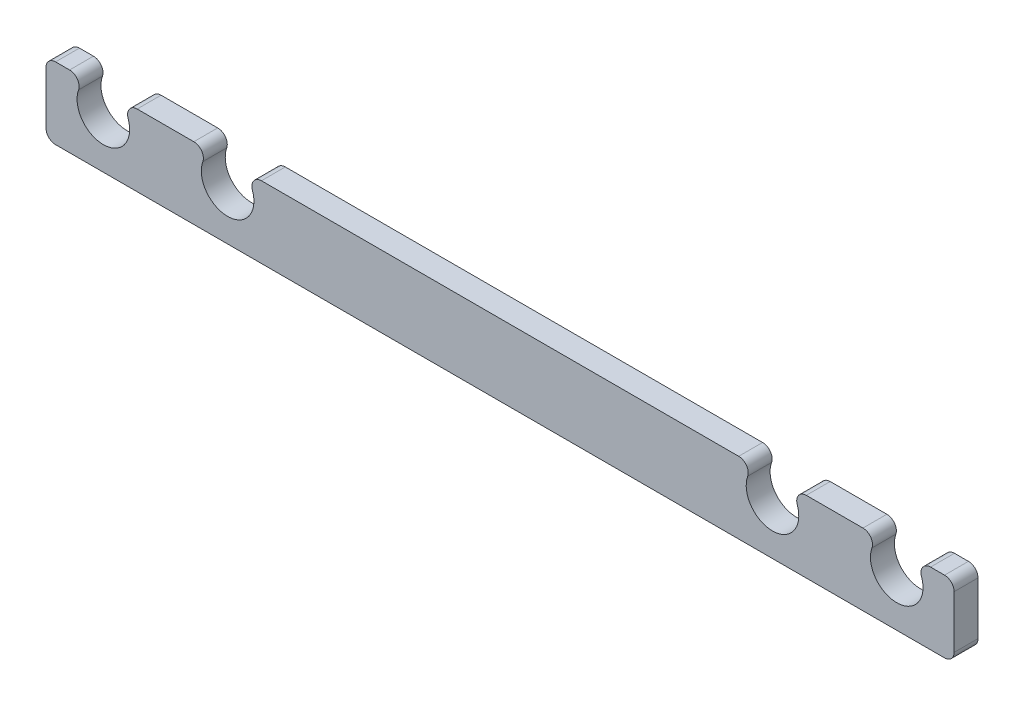
ISO-10303-21;
HEADER;
FILE_DESCRIPTION(('STEP AP214'),'2;1');
FILE_NAME('part.step','',(''),(''),'','','');
FILE_SCHEMA(('AUTOMOTIVE_DESIGN { 1 0 10303 214 1 1 1 1 }'));
ENDSEC;
DATA;
#1=APPLICATION_CONTEXT('core data for automotive mechanical design processes');
#2=APPLICATION_PROTOCOL_DEFINITION('international standard','automotive_design',2000,#1);
#3=PRODUCT_CONTEXT('',#1,'mechanical');
#4=PRODUCT('Part','Part','',(#3));
#5=PRODUCT_RELATED_PRODUCT_CATEGORY('part','',(#4));
#6=PRODUCT_DEFINITION_FORMATION('','',#4);
#7=PRODUCT_DEFINITION_CONTEXT('part definition',#1,'design');
#8=PRODUCT_DEFINITION('design','',#6,#7);
#9=PRODUCT_DEFINITION_SHAPE('','',#8);
#10=(LENGTH_UNIT() NAMED_UNIT(*) SI_UNIT(.MILLI.,.METRE.));
#11=(NAMED_UNIT(*) PLANE_ANGLE_UNIT() SI_UNIT($,.RADIAN.));
#12=(NAMED_UNIT(*) SI_UNIT($,.STERADIAN.) SOLID_ANGLE_UNIT());
#13=UNCERTAINTY_MEASURE_WITH_UNIT(LENGTH_MEASURE(1.E-05),#10,'distance_accuracy_value','');
#14=(GEOMETRIC_REPRESENTATION_CONTEXT(3) GLOBAL_UNCERTAINTY_ASSIGNED_CONTEXT((#13)) GLOBAL_UNIT_ASSIGNED_CONTEXT((#10,
#11,#12)) REPRESENTATION_CONTEXT('',''));
#15=CARTESIAN_POINT('',(0.,0.,0.));
#16=DIRECTION('',(0.,0.,1.));
#17=DIRECTION('',(1.,0.,0.));
#18=AXIS2_PLACEMENT_3D('',#15,#16,#17);
#19=CARTESIAN_POINT('',(-95.,0.,5.));
#20=DIRECTION('',(0.,-1.,0.));
#21=DIRECTION('',(0.,0.,-1.));
#22=AXIS2_PLACEMENT_3D('',#19,#20,#21);
#23=PLANE('',#22);
#24=DIRECTION('',(-1.,0.,0.));
#25=VECTOR('',#24,1.);
#26=CARTESIAN_POINT('',(-95.,0.,5.));
#27=LINE('',#26,#25);
#28=CARTESIAN_POINT('',(-90.0710678118655,0.,5.));
#29=VERTEX_POINT('',#28);
#30=CARTESIAN_POINT('',(-93.,0.,5.));
#31=VERTEX_POINT('',#30);
#32=EDGE_CURVE('E221',#29,#31,#27,.T.);
#33=ORIENTED_EDGE('',*,*,#32,.F.);
#34=DIRECTION('',(0.,0.,-1.));
#35=VECTOR('',#34,1.);
#36=CARTESIAN_POINT('',(-90.0710678118655,0.,5.));
#37=LINE('',#36,#35);
#38=CARTESIAN_POINT('',(-90.0710678118655,0.,0.));
#39=VERTEX_POINT('',#38);
#40=EDGE_CURVE('E206',#29,#39,#37,.T.);
#41=ORIENTED_EDGE('',*,*,#40,.T.);
#42=DIRECTION('',(-1.,0.,0.));
#43=VECTOR('',#42,1.);
#44=CARTESIAN_POINT('',(-95.,0.,0.));
#45=LINE('',#44,#43);
#46=CARTESIAN_POINT('',(-93.,0.,0.));
#47=VERTEX_POINT('',#46);
#48=EDGE_CURVE('E218',#39,#47,#45,.T.);
#49=ORIENTED_EDGE('',*,*,#48,.T.);
#50=DIRECTION('',(0.,0.,-1.));
#51=VECTOR('',#50,1.);
#52=CARTESIAN_POINT('',(-93.,0.,5.));
#53=LINE('',#52,#51);
#54=EDGE_CURVE('E223',#47,#31,#53,.F.);
#55=ORIENTED_EDGE('',*,*,#54,.T.);
#56=EDGE_LOOP('',(#33,#41,#49,#55));
#57=FACE_BOUND('',#56,.T.);
#58=ADVANCED_FACE('F40',(#57),#23,.F.);
#59=CARTESIAN_POINT('',(-95.,-15.,5.));
#60=DIRECTION('',(1.,0.,0.));
#61=DIRECTION('',(0.,0.,-1.));
#62=AXIS2_PLACEMENT_3D('',#59,#60,#61);
#63=PLANE('',#62);
#64=DIRECTION('',(0.,-1.,0.));
#65=VECTOR('',#64,1.);
#66=CARTESIAN_POINT('',(-95.,-15.,0.));
#67=LINE('',#66,#65);
#68=CARTESIAN_POINT('',(-95.,-2.,0.));
#69=VERTEX_POINT('',#68);
#70=CARTESIAN_POINT('',(-95.,-13.,0.));
#71=VERTEX_POINT('',#70);
#72=EDGE_CURVE('E228',#69,#71,#67,.T.);
#73=ORIENTED_EDGE('',*,*,#72,.T.);
#74=DIRECTION('',(0.,0.,-1.));
#75=VECTOR('',#74,1.);
#76=CARTESIAN_POINT('',(-95.,-13.,5.));
#77=LINE('',#76,#75);
#78=CARTESIAN_POINT('',(-95.,-13.,5.));
#79=VERTEX_POINT('',#78);
#80=EDGE_CURVE('E330',#71,#79,#77,.F.);
#81=ORIENTED_EDGE('',*,*,#80,.T.);
#82=DIRECTION('',(0.,-1.,0.));
#83=VECTOR('',#82,1.);
#84=CARTESIAN_POINT('',(-95.,-15.,5.));
#85=LINE('',#84,#83);
#86=CARTESIAN_POINT('',(-95.,-2.,5.));
#87=VERTEX_POINT('',#86);
#88=EDGE_CURVE('E553',#87,#79,#85,.T.);
#89=ORIENTED_EDGE('',*,*,#88,.F.);
#90=DIRECTION('',(0.,0.,-1.));
#91=VECTOR('',#90,1.);
#92=CARTESIAN_POINT('',(-95.,-2.,5.));
#93=LINE('',#92,#91);
#94=EDGE_CURVE('E327',#87,#69,#93,.T.);
#95=ORIENTED_EDGE('',*,*,#94,.T.);
#96=EDGE_LOOP('',(#73,#81,#89,#95));
#97=FACE_BOUND('',#96,.T.);
#98=ADVANCED_FACE('F483',(#97),#63,.F.);
#99=CARTESIAN_POINT('',(95.,-15.,5.));
#100=DIRECTION('',(0.,1.,0.));
#101=DIRECTION('',(0.,0.,1.));
#102=AXIS2_PLACEMENT_3D('',#99,#100,#101);
#103=PLANE('',#102);
#104=DIRECTION('',(1.,0.,0.));
#105=VECTOR('',#104,1.);
#106=CARTESIAN_POINT('',(95.,-15.,5.));
#107=LINE('',#106,#105);
#108=CARTESIAN_POINT('',(-93.,-15.,5.));
#109=VERTEX_POINT('',#108);
#110=CARTESIAN_POINT('',(93.,-15.,5.));
#111=VERTEX_POINT('',#110);
#112=EDGE_CURVE('E551',#109,#111,#107,.T.);
#113=ORIENTED_EDGE('',*,*,#112,.F.);
#114=DIRECTION('',(0.,0.,-1.));
#115=VECTOR('',#114,1.);
#116=CARTESIAN_POINT('',(-93.,-15.,5.));
#117=LINE('',#116,#115);
#118=CARTESIAN_POINT('',(-93.,-15.,0.));
#119=VERTEX_POINT('',#118);
#120=EDGE_CURVE('E324',#109,#119,#117,.T.);
#121=ORIENTED_EDGE('',*,*,#120,.T.);
#122=DIRECTION('',(1.,0.,0.));
#123=VECTOR('',#122,1.);
#124=CARTESIAN_POINT('',(95.,-15.,0.));
#125=LINE('',#124,#123);
#126=CARTESIAN_POINT('',(93.,-15.,0.));
#127=VERTEX_POINT('',#126);
#128=EDGE_CURVE('E231',#119,#127,#125,.T.);
#129=ORIENTED_EDGE('',*,*,#128,.T.);
#130=DIRECTION('',(0.,0.,-1.));
#131=VECTOR('',#130,1.);
#132=CARTESIAN_POINT('',(93.,-15.,5.));
#133=LINE('',#132,#131);
#134=EDGE_CURVE('E322',#127,#111,#133,.F.);
#135=ORIENTED_EDGE('',*,*,#134,.T.);
#136=EDGE_LOOP('',(#113,#121,#129,#135));
#137=FACE_BOUND('',#136,.T.);
#138=ADVANCED_FACE('F488',(#137),#103,.F.);
#139=CARTESIAN_POINT('',(95.,0.,5.));
#140=DIRECTION('',(-1.,0.,0.));
#141=DIRECTION('',(0.,0.,1.));
#142=AXIS2_PLACEMENT_3D('',#139,#140,#141);
#143=PLANE('',#142);
#144=DIRECTION('',(0.,1.,0.));
#145=VECTOR('',#144,1.);
#146=CARTESIAN_POINT('',(95.,0.,5.));
#147=LINE('',#146,#145);
#148=CARTESIAN_POINT('',(95.,-13.,5.));
#149=VERTEX_POINT('',#148);
#150=CARTESIAN_POINT('',(95.,-2.,5.));
#151=VERTEX_POINT('',#150);
#152=EDGE_CURVE('E397',#149,#151,#147,.T.);
#153=ORIENTED_EDGE('',*,*,#152,.F.);
#154=DIRECTION('',(0.,0.,-1.));
#155=VECTOR('',#154,1.);
#156=CARTESIAN_POINT('',(95.,-13.,5.));
#157=LINE('',#156,#155);
#158=CARTESIAN_POINT('',(95.,-13.,0.));
#159=VERTEX_POINT('',#158);
#160=EDGE_CURVE('E348',#149,#159,#157,.T.);
#161=ORIENTED_EDGE('',*,*,#160,.T.);
#162=DIRECTION('',(0.,1.,0.));
#163=VECTOR('',#162,1.);
#164=CARTESIAN_POINT('',(95.,0.,0.));
#165=LINE('',#164,#163);
#166=CARTESIAN_POINT('',(95.,-2.,0.));
#167=VERTEX_POINT('',#166);
#168=EDGE_CURVE('E239',#159,#167,#165,.T.);
#169=ORIENTED_EDGE('',*,*,#168,.T.);
#170=DIRECTION('',(0.,0.,-1.));
#171=VECTOR('',#170,1.);
#172=CARTESIAN_POINT('',(95.,-2.,5.));
#173=LINE('',#172,#171);
#174=EDGE_CURVE('E346',#167,#151,#173,.F.);
#175=ORIENTED_EDGE('',*,*,#174,.T.);
#176=EDGE_LOOP('',(#153,#161,#169,#175));
#177=FACE_BOUND('',#176,.T.);
#178=ADVANCED_FACE('F578',(#177),#143,.F.);
#179=CARTESIAN_POINT('',(86.1622776601684,0.,5.));
#180=DIRECTION('',(0.,-1.,0.));
#181=DIRECTION('',(0.,0.,-1.));
#182=AXIS2_PLACEMENT_3D('',#179,#180,#181);
#183=PLANE('',#182);
#184=DIRECTION('',(-1.,0.,0.));
#185=VECTOR('',#184,1.);
#186=CARTESIAN_POINT('',(86.1622776601684,0.,0.));
#187=LINE('',#186,#185);
#188=CARTESIAN_POINT('',(93.,0.,0.));
#189=VERTEX_POINT('',#188);
#190=CARTESIAN_POINT('',(90.0710678118655,0.,0.));
#191=VERTEX_POINT('',#190);
#192=EDGE_CURVE('E242',#189,#191,#187,.T.);
#193=ORIENTED_EDGE('',*,*,#192,.T.);
#194=DIRECTION('',(0.,0.,-1.));
#195=VECTOR('',#194,1.);
#196=CARTESIAN_POINT('',(90.0710678118655,0.,5.));
#197=LINE('',#196,#195);
#198=CARTESIAN_POINT('',(90.0710678118655,0.,5.));
#199=VERTEX_POINT('',#198);
#200=EDGE_CURVE('E12',#191,#199,#197,.F.);
#201=ORIENTED_EDGE('',*,*,#200,.T.);
#202=DIRECTION('',(-1.,0.,0.));
#203=VECTOR('',#202,1.);
#204=CARTESIAN_POINT('',(86.1622776601684,0.,5.));
#205=LINE('',#204,#203);
#206=CARTESIAN_POINT('',(93.,0.,5.));
#207=VERTEX_POINT('',#206);
#208=EDGE_CURVE('E373',#207,#199,#205,.T.);
#209=ORIENTED_EDGE('',*,*,#208,.F.);
#210=DIRECTION('',(0.,0.,-1.));
#211=VECTOR('',#210,1.);
#212=CARTESIAN_POINT('',(93.,0.,5.));
#213=LINE('',#212,#211);
#214=EDGE_CURVE('E48',#207,#189,#213,.T.);
#215=ORIENTED_EDGE('',*,*,#214,.T.);
#216=EDGE_LOOP('',(#193,#201,#209,#215));
#217=FACE_BOUND('',#216,.T.);
#218=ADVANCED_FACE('F370',(#217),#183,.F.);
#219=CARTESIAN_POINT('',(83.,-4.5,5.));
#220=DIRECTION('',(0.,0.,-1.));
#221=DIRECTION('',(-1.,0.,0.));
#222=AXIS2_PLACEMENT_3D('',#219,#220,#221);
#223=CYLINDRICAL_SURFACE('',#222,5.5);
#224=CARTESIAN_POINT('',(83.,-4.5,0.));
#225=DIRECTION('',(0.,0.,-1.));
#226=DIRECTION('',(1.,0.,0.));
#227=AXIS2_PLACEMENT_3D('',#224,#225,#226);
#228=CIRCLE('',#227,5.5);
#229=CARTESIAN_POINT('',(88.1854497287013,-2.66666666666666,0.));
#230=VERTEX_POINT('',#229);
#231=CARTESIAN_POINT('',(77.8145502712987,-2.66666666666666,0.));
#232=VERTEX_POINT('',#231);
#233=EDGE_CURVE('E245',#230,#232,#228,.T.);
#234=ORIENTED_EDGE('',*,*,#233,.T.);
#235=DIRECTION('',(0.,0.,-1.));
#236=VECTOR('',#235,1.);
#237=CARTESIAN_POINT('',(77.8145502712987,-2.66666666666666,5.));
#238=LINE('',#237,#236);
#239=CARTESIAN_POINT('',(77.8145502712987,-2.66666666666666,5.));
#240=VERTEX_POINT('',#239);
#241=EDGE_CURVE('E364',#232,#240,#238,.F.);
#242=ORIENTED_EDGE('',*,*,#241,.T.);
#243=CARTESIAN_POINT('',(83.,-4.5,5.));
#244=DIRECTION('',(0.,0.,-1.));
#245=DIRECTION('',(1.,0.,0.));
#246=AXIS2_PLACEMENT_3D('',#243,#244,#245);
#247=CIRCLE('',#246,5.5);
#248=CARTESIAN_POINT('',(88.1854497287013,-2.66666666666666,5.));
#249=VERTEX_POINT('',#248);
#250=EDGE_CURVE('E387',#249,#240,#247,.T.);
#251=ORIENTED_EDGE('',*,*,#250,.F.);
#252=DIRECTION('',(0.,0.,-1.));
#253=VECTOR('',#252,1.);
#254=CARTESIAN_POINT('',(88.1854497287013,-2.66666666666666,5.));
#255=LINE('',#254,#253);
#256=EDGE_CURVE('E361',#249,#230,#255,.T.);
#257=ORIENTED_EDGE('',*,*,#256,.T.);
#258=EDGE_LOOP('',(#234,#242,#251,#257));
#259=FACE_BOUND('',#258,.T.);
#260=ADVANCED_FACE('F384',(#259),#223,.F.);
#261=CARTESIAN_POINT('',(60.1622776601684,0.,5.));
#262=DIRECTION('',(0.,-1.,0.));
#263=DIRECTION('',(0.,0.,-1.));
#264=AXIS2_PLACEMENT_3D('',#261,#262,#263);
#265=PLANE('',#264);
#266=DIRECTION('',(-1.,0.,0.));
#267=VECTOR('',#266,1.);
#268=CARTESIAN_POINT('',(60.1622776601684,0.,0.));
#269=LINE('',#268,#267);
#270=CARTESIAN_POINT('',(75.9289321881345,0.,0.));
#271=VERTEX_POINT('',#270);
#272=CARTESIAN_POINT('',(64.0710678118655,0.,0.));
#273=VERTEX_POINT('',#272);
#274=EDGE_CURVE('E248',#271,#273,#269,.T.);
#275=ORIENTED_EDGE('',*,*,#274,.T.);
#276=DIRECTION('',(0.,0.,-1.));
#277=VECTOR('',#276,1.);
#278=CARTESIAN_POINT('',(64.0710678118655,0.,5.));
#279=LINE('',#278,#277);
#280=CARTESIAN_POINT('',(64.0710678118655,0.,5.));
#281=VERTEX_POINT('',#280);
#282=EDGE_CURVE('E359',#273,#281,#279,.F.);
#283=ORIENTED_EDGE('',*,*,#282,.T.);
#284=DIRECTION('',(-1.,0.,0.));
#285=VECTOR('',#284,1.);
#286=CARTESIAN_POINT('',(60.1622776601684,0.,5.));
#287=LINE('',#286,#285);
#288=CARTESIAN_POINT('',(75.9289321881345,0.,5.));
#289=VERTEX_POINT('',#288);
#290=EDGE_CURVE('E390',#289,#281,#287,.T.);
#291=ORIENTED_EDGE('',*,*,#290,.F.);
#292=DIRECTION('',(0.,0.,-1.));
#293=VECTOR('',#292,1.);
#294=CARTESIAN_POINT('',(75.9289321881345,0.,5.));
#295=LINE('',#294,#293);
#296=EDGE_CURVE('E356',#289,#271,#295,.T.);
#297=ORIENTED_EDGE('',*,*,#296,.T.);
#298=EDGE_LOOP('',(#275,#283,#291,#297));
#299=FACE_BOUND('',#298,.T.);
#300=ADVANCED_FACE('F470',(#299),#265,.F.);
#301=CARTESIAN_POINT('',(57.,-4.5,5.));
#302=DIRECTION('',(0.,0.,-1.));
#303=DIRECTION('',(-1.,0.,0.));
#304=AXIS2_PLACEMENT_3D('',#301,#302,#303);
#305=CYLINDRICAL_SURFACE('',#304,5.5);
#306=CARTESIAN_POINT('',(57.,-4.5,0.));
#307=DIRECTION('',(0.,0.,-1.));
#308=DIRECTION('',(-1.,0.,0.));
#309=AXIS2_PLACEMENT_3D('',#306,#307,#308);
#310=CIRCLE('',#309,5.5);
#311=CARTESIAN_POINT('',(62.1854497287014,-2.66666666666667,0.));
#312=VERTEX_POINT('',#311);
#313=CARTESIAN_POINT('',(51.8145502712987,-2.66666666666667,0.));
#314=VERTEX_POINT('',#313);
#315=EDGE_CURVE('E251',#312,#314,#310,.T.);
#316=ORIENTED_EDGE('',*,*,#315,.T.);
#317=DIRECTION('',(0.,0.,-1.));
#318=VECTOR('',#317,1.);
#319=CARTESIAN_POINT('',(51.8145502712987,-2.66666666666667,5.));
#320=LINE('',#319,#318);
#321=CARTESIAN_POINT('',(51.8145502712987,-2.66666666666667,5.));
#322=VERTEX_POINT('',#321);
#323=EDGE_CURVE('E354',#314,#322,#320,.F.);
#324=ORIENTED_EDGE('',*,*,#323,.T.);
#325=CARTESIAN_POINT('',(57.,-4.5,5.));
#326=DIRECTION('',(0.,0.,-1.));
#327=DIRECTION('',(-1.,0.,0.));
#328=AXIS2_PLACEMENT_3D('',#325,#326,#327);
#329=CIRCLE('',#328,5.5);
#330=CARTESIAN_POINT('',(62.1854497287014,-2.66666666666667,5.));
#331=VERTEX_POINT('',#330);
#332=EDGE_CURVE('E394',#331,#322,#329,.T.);
#333=ORIENTED_EDGE('',*,*,#332,.F.);
#334=DIRECTION('',(0.,0.,-1.));
#335=VECTOR('',#334,1.);
#336=CARTESIAN_POINT('',(62.1854497287014,-2.66666666666667,5.));
#337=LINE('',#336,#335);
#338=EDGE_CURVE('E351',#331,#312,#337,.T.);
#339=ORIENTED_EDGE('',*,*,#338,.T.);
#340=EDGE_LOOP('',(#316,#324,#333,#339));
#341=FACE_BOUND('',#340,.T.);
#342=ADVANCED_FACE('F461',(#341),#305,.F.);
#343=CARTESIAN_POINT('',(-53.8377223398316,0.,5.));
#344=DIRECTION('',(0.,-1.,0.));
#345=DIRECTION('',(0.,0.,-1.));
#346=AXIS2_PLACEMENT_3D('',#343,#344,#345);
#347=PLANE('',#346);
#348=DIRECTION('',(-1.,0.,0.));
#349=VECTOR('',#348,1.);
#350=CARTESIAN_POINT('',(-53.8377223398316,0.,0.));
#351=LINE('',#350,#349);
#352=CARTESIAN_POINT('',(49.9289321881345,0.,0.));
#353=VERTEX_POINT('',#352);
#354=CARTESIAN_POINT('',(-49.9289321881345,0.,0.));
#355=VERTEX_POINT('',#354);
#356=EDGE_CURVE('E254',#353,#355,#351,.T.);
#357=ORIENTED_EDGE('',*,*,#356,.T.);
#358=DIRECTION('',(0.,0.,-1.));
#359=VECTOR('',#358,1.);
#360=CARTESIAN_POINT('',(-49.9289321881345,0.,5.));
#361=LINE('',#360,#359);
#362=CARTESIAN_POINT('',(-49.9289321881345,0.,5.));
#363=VERTEX_POINT('',#362);
#364=EDGE_CURVE('E340',#355,#363,#361,.F.);
#365=ORIENTED_EDGE('',*,*,#364,.T.);
#366=DIRECTION('',(-1.,0.,0.));
#367=VECTOR('',#366,1.);
#368=CARTESIAN_POINT('',(-53.8377223398316,0.,5.));
#369=LINE('',#368,#367);
#370=CARTESIAN_POINT('',(49.9289321881345,0.,5.));
#371=VERTEX_POINT('',#370);
#372=EDGE_CURVE('E414',#371,#363,#369,.T.);
#373=ORIENTED_EDGE('',*,*,#372,.F.);
#374=DIRECTION('',(0.,0.,-1.));
#375=VECTOR('',#374,1.);
#376=CARTESIAN_POINT('',(49.9289321881345,0.,5.));
#377=LINE('',#376,#375);
#378=EDGE_CURVE('E337',#371,#353,#377,.T.);
#379=ORIENTED_EDGE('',*,*,#378,.T.);
#380=EDGE_LOOP('',(#357,#365,#373,#379));
#381=FACE_BOUND('',#380,.T.);
#382=ADVANCED_FACE('F452',(#381),#347,.F.);
#383=CARTESIAN_POINT('',(-57.,-4.5,5.));
#384=DIRECTION('',(0.,0.,-1.));
#385=DIRECTION('',(-1.,0.,0.));
#386=AXIS2_PLACEMENT_3D('',#383,#384,#385);
#387=CYLINDRICAL_SURFACE('',#386,5.5);
#388=CARTESIAN_POINT('',(-57.,-4.5,5.));
#389=DIRECTION('',(0.,0.,-1.));
#390=DIRECTION('',(1.,0.,0.));
#391=AXIS2_PLACEMENT_3D('',#388,#389,#390);
#392=CIRCLE('',#391,5.5);
#393=CARTESIAN_POINT('',(-51.8145502712987,-2.66666666666667,5.));
#394=VERTEX_POINT('',#393);
#395=CARTESIAN_POINT('',(-62.1854497287014,-2.66666666666667,5.));
#396=VERTEX_POINT('',#395);
#397=EDGE_CURVE('E419',#394,#396,#392,.T.);
#398=ORIENTED_EDGE('',*,*,#397,.F.);
#399=DIRECTION('',(0.,0.,-1.));
#400=VECTOR('',#399,1.);
#401=CARTESIAN_POINT('',(-51.8145502712987,-2.66666666666667,5.));
#402=LINE('',#401,#400);
#403=CARTESIAN_POINT('',(-51.8145502712987,-2.66666666666667,0.));
#404=VERTEX_POINT('',#403);
#405=EDGE_CURVE('E334',#394,#404,#402,.T.);
#406=ORIENTED_EDGE('',*,*,#405,.T.);
#407=CARTESIAN_POINT('',(-57.,-4.5,0.));
#408=DIRECTION('',(0.,0.,-1.));
#409=DIRECTION('',(1.,0.,0.));
#410=AXIS2_PLACEMENT_3D('',#407,#408,#409);
#411=CIRCLE('',#410,5.5);
#412=CARTESIAN_POINT('',(-62.1854497287014,-2.66666666666667,0.));
#413=VERTEX_POINT('',#412);
#414=EDGE_CURVE('E257',#404,#413,#411,.T.);
#415=ORIENTED_EDGE('',*,*,#414,.T.);
#416=DIRECTION('',(0.,0.,-1.));
#417=VECTOR('',#416,1.);
#418=CARTESIAN_POINT('',(-62.1854497287014,-2.66666666666667,5.));
#419=LINE('',#418,#417);
#420=EDGE_CURVE('E332',#413,#396,#419,.F.);
#421=ORIENTED_EDGE('',*,*,#420,.T.);
#422=EDGE_LOOP('',(#398,#406,#415,#421));
#423=FACE_BOUND('',#422,.T.);
#424=ADVANCED_FACE('F444',(#423),#387,.F.);
#425=CARTESIAN_POINT('',(-79.8377223398316,0.,5.));
#426=DIRECTION('',(0.,-1.,0.));
#427=DIRECTION('',(0.,0.,-1.));
#428=AXIS2_PLACEMENT_3D('',#425,#426,#427);
#429=PLANE('',#428);
#430=DIRECTION('',(-1.,0.,0.));
#431=VECTOR('',#430,1.);
#432=CARTESIAN_POINT('',(-79.8377223398316,0.,5.));
#433=LINE('',#432,#431);
#434=CARTESIAN_POINT('',(-64.0710678118655,0.,5.));
#435=VERTEX_POINT('',#434);
#436=CARTESIAN_POINT('',(-75.9289321881345,0.,5.));
#437=VERTEX_POINT('',#436);
#438=EDGE_CURVE('E422',#435,#437,#433,.T.);
#439=ORIENTED_EDGE('',*,*,#438,.F.);
#440=DIRECTION('',(0.,0.,-1.));
#441=VECTOR('',#440,1.);
#442=CARTESIAN_POINT('',(-64.0710678118655,0.,5.));
#443=LINE('',#442,#441);
#444=CARTESIAN_POINT('',(-64.0710678118655,0.,0.));
#445=VERTEX_POINT('',#444);
#446=EDGE_CURVE('E343',#435,#445,#443,.T.);
#447=ORIENTED_EDGE('',*,*,#446,.T.);
#448=DIRECTION('',(-1.,0.,0.));
#449=VECTOR('',#448,1.);
#450=CARTESIAN_POINT('',(-79.8377223398316,0.,0.));
#451=LINE('',#450,#449);
#452=CARTESIAN_POINT('',(-75.9289321881345,0.,0.));
#453=VERTEX_POINT('',#452);
#454=EDGE_CURVE('E260',#445,#453,#451,.T.);
#455=ORIENTED_EDGE('',*,*,#454,.T.);
#456=DIRECTION('',(0.,0.,-1.));
#457=VECTOR('',#456,1.);
#458=CARTESIAN_POINT('',(-75.9289321881345,0.,5.));
#459=LINE('',#458,#457);
#460=EDGE_CURVE('E55',#453,#437,#459,.F.);
#461=ORIENTED_EDGE('',*,*,#460,.T.);
#462=EDGE_LOOP('',(#439,#447,#455,#461));
#463=FACE_BOUND('',#462,.T.);
#464=ADVANCED_FACE('F436',(#463),#429,.F.);
#465=CARTESIAN_POINT('',(-83.,-4.5,5.));
#466=DIRECTION('',(0.,0.,-1.));
#467=DIRECTION('',(-1.,0.,0.));
#468=AXIS2_PLACEMENT_3D('',#465,#466,#467);
#469=CYLINDRICAL_SURFACE('',#468,5.5);
#470=CARTESIAN_POINT('',(-83.,-4.5,0.));
#471=DIRECTION('',(0.,0.,-1.));
#472=DIRECTION('',(-1.,0.,0.));
#473=AXIS2_PLACEMENT_3D('',#470,#471,#472);
#474=CIRCLE('',#473,5.5);
#475=CARTESIAN_POINT('',(-77.8145502712987,-2.66666666666666,0.));
#476=VERTEX_POINT('',#475);
#477=CARTESIAN_POINT('',(-88.1854497287013,-2.66666666666666,0.));
#478=VERTEX_POINT('',#477);
#479=EDGE_CURVE('E262',#476,#478,#474,.T.);
#480=ORIENTED_EDGE('',*,*,#479,.T.);
#481=DIRECTION('',(0.,0.,-1.));
#482=VECTOR('',#481,1.);
#483=CARTESIAN_POINT('',(-88.1854497287013,-2.66666666666666,5.));
#484=LINE('',#483,#482);
#485=CARTESIAN_POINT('',(-88.1854497287013,-2.66666666666666,5.));
#486=VERTEX_POINT('',#485);
#487=EDGE_CURVE('E207',#478,#486,#484,.F.);
#488=ORIENTED_EDGE('',*,*,#487,.T.);
#489=CARTESIAN_POINT('',(-83.,-4.5,5.));
#490=DIRECTION('',(0.,0.,-1.));
#491=DIRECTION('',(-1.,0.,0.));
#492=AXIS2_PLACEMENT_3D('',#489,#490,#491);
#493=CIRCLE('',#492,5.5);
#494=CARTESIAN_POINT('',(-77.8145502712987,-2.66666666666666,5.));
#495=VERTEX_POINT('',#494);
#496=EDGE_CURVE('E234',#495,#486,#493,.T.);
#497=ORIENTED_EDGE('',*,*,#496,.F.);
#498=DIRECTION('',(0.,0.,-1.));
#499=VECTOR('',#498,1.);
#500=CARTESIAN_POINT('',(-77.8145502712987,-2.66666666666666,5.));
#501=LINE('',#500,#499);
#502=EDGE_CURVE('E212',#495,#476,#501,.T.);
#503=ORIENTED_EDGE('',*,*,#502,.T.);
#504=EDGE_LOOP('',(#480,#488,#497,#503));
#505=FACE_BOUND('',#504,.T.);
#506=ADVANCED_FACE('F432',(#505),#469,.F.);
#507=CARTESIAN_POINT('',(-83.,-4.5,5.));
#508=DIRECTION('',(0.,0.,-1.));
#509=DIRECTION('',(-1.,0.,0.));
#510=AXIS2_PLACEMENT_3D('',#507,#508,#509);
#511=PLANE('',#510);
#512=ORIENTED_EDGE('',*,*,#496,.T.);
#513=CARTESIAN_POINT('',(-90.0710678118655,-2.,5.));
#514=DIRECTION('',(0.,0.,-1.));
#515=DIRECTION('',(-1.,0.,0.));
#516=AXIS2_PLACEMENT_3D('',#513,#514,#515);
#517=CIRCLE('',#516,2.);
#518=EDGE_CURVE('E319',#486,#29,#517,.F.);
#519=ORIENTED_EDGE('',*,*,#518,.T.);
#520=ORIENTED_EDGE('',*,*,#32,.T.);
#521=CARTESIAN_POINT('',(-93.,-2.,5.));
#522=DIRECTION('',(0.,0.,-1.));
#523=DIRECTION('',(-1.,0.,0.));
#524=AXIS2_PLACEMENT_3D('',#521,#522,#523);
#525=CIRCLE('',#524,2.);
#526=EDGE_CURVE('E305',#31,#87,#525,.F.);
#527=ORIENTED_EDGE('',*,*,#526,.T.);
#528=ORIENTED_EDGE('',*,*,#88,.T.);
#529=CARTESIAN_POINT('',(-93.,-13.,5.));
#530=DIRECTION('',(0.,0.,-1.));
#531=DIRECTION('',(-1.,0.,0.));
#532=AXIS2_PLACEMENT_3D('',#529,#530,#531);
#533=CIRCLE('',#532,2.);
#534=EDGE_CURVE('E316',#79,#109,#533,.F.);
#535=ORIENTED_EDGE('',*,*,#534,.T.);
#536=ORIENTED_EDGE('',*,*,#112,.T.);
#537=CARTESIAN_POINT('',(93.,-13.,5.));
#538=DIRECTION('',(0.,0.,-1.));
#539=DIRECTION('',(-1.,0.,0.));
#540=AXIS2_PLACEMENT_3D('',#537,#538,#539);
#541=CIRCLE('',#540,2.);
#542=EDGE_CURVE('E302',#111,#149,#541,.F.);
#543=ORIENTED_EDGE('',*,*,#542,.T.);
#544=ORIENTED_EDGE('',*,*,#152,.T.);
#545=CARTESIAN_POINT('',(93.,-2.,5.));
#546=DIRECTION('',(0.,0.,-1.));
#547=DIRECTION('',(-1.,0.,0.));
#548=AXIS2_PLACEMENT_3D('',#545,#546,#547);
#549=CIRCLE('',#548,2.);
#550=EDGE_CURVE('E287',#151,#207,#549,.F.);
#551=ORIENTED_EDGE('',*,*,#550,.T.);
#552=ORIENTED_EDGE('',*,*,#208,.T.);
#553=CARTESIAN_POINT('',(90.0710678118655,-2.,5.));
#554=DIRECTION('',(0.,0.,-1.));
#555=DIRECTION('',(-1.,0.,0.));
#556=AXIS2_PLACEMENT_3D('',#553,#554,#555);
#557=CIRCLE('',#556,2.);
#558=EDGE_CURVE('E290',#199,#249,#557,.F.);
#559=ORIENTED_EDGE('',*,*,#558,.T.);
#560=ORIENTED_EDGE('',*,*,#250,.T.);
#561=CARTESIAN_POINT('',(75.9289321881345,-2.,5.));
#562=DIRECTION('',(0.,0.,-1.));
#563=DIRECTION('',(-1.,0.,0.));
#564=AXIS2_PLACEMENT_3D('',#561,#562,#563);
#565=CIRCLE('',#564,2.);
#566=EDGE_CURVE('E293',#240,#289,#565,.F.);
#567=ORIENTED_EDGE('',*,*,#566,.T.);
#568=ORIENTED_EDGE('',*,*,#290,.T.);
#569=CARTESIAN_POINT('',(64.0710678118655,-2.,5.));
#570=DIRECTION('',(0.,0.,-1.));
#571=DIRECTION('',(-1.,0.,0.));
#572=AXIS2_PLACEMENT_3D('',#569,#570,#571);
#573=CIRCLE('',#572,2.);
#574=EDGE_CURVE('E296',#281,#331,#573,.F.);
#575=ORIENTED_EDGE('',*,*,#574,.T.);
#576=ORIENTED_EDGE('',*,*,#332,.T.);
#577=CARTESIAN_POINT('',(49.9289321881345,-2.,5.));
#578=DIRECTION('',(0.,0.,-1.));
#579=DIRECTION('',(-1.,0.,0.));
#580=AXIS2_PLACEMENT_3D('',#577,#578,#579);
#581=CIRCLE('',#580,2.);
#582=EDGE_CURVE('E299',#322,#371,#581,.F.);
#583=ORIENTED_EDGE('',*,*,#582,.T.);
#584=ORIENTED_EDGE('',*,*,#372,.T.);
#585=CARTESIAN_POINT('',(-49.9289321881345,-2.,5.));
#586=DIRECTION('',(0.,0.,-1.));
#587=DIRECTION('',(-1.,0.,0.));
#588=AXIS2_PLACEMENT_3D('',#585,#586,#587);
#589=CIRCLE('',#588,2.);
#590=EDGE_CURVE('E313',#363,#394,#589,.F.);
#591=ORIENTED_EDGE('',*,*,#590,.T.);
#592=ORIENTED_EDGE('',*,*,#397,.T.);
#593=CARTESIAN_POINT('',(-64.0710678118655,-2.,5.));
#594=DIRECTION('',(0.,0.,-1.));
#595=DIRECTION('',(-1.,0.,0.));
#596=AXIS2_PLACEMENT_3D('',#593,#594,#595);
#597=CIRCLE('',#596,2.);
#598=EDGE_CURVE('E62',#396,#435,#597,.F.);
#599=ORIENTED_EDGE('',*,*,#598,.T.);
#600=ORIENTED_EDGE('',*,*,#438,.T.);
#601=CARTESIAN_POINT('',(-75.9289321881345,-2.,5.));
#602=DIRECTION('',(0.,0.,-1.));
#603=DIRECTION('',(-1.,0.,0.));
#604=AXIS2_PLACEMENT_3D('',#601,#602,#603);
#605=CIRCLE('',#604,2.);
#606=EDGE_CURVE('E308',#437,#495,#605,.F.);
#607=ORIENTED_EDGE('',*,*,#606,.T.);
#608=EDGE_LOOP('',(#512,#519,#520,#527,#528,#535,#536,#543,#544,#551,#552,#559,#560,#567,#568,
#575,#576,#583,#584,#591,#592,#599,#600,#607));
#609=FACE_BOUND('',#608,.T.);
#610=ADVANCED_FACE('F429',(#609),#511,.F.);
#611=CARTESIAN_POINT('',(-83.,-4.5,0.));
#612=DIRECTION('',(0.,0.,-1.));
#613=DIRECTION('',(-1.,0.,0.));
#614=AXIS2_PLACEMENT_3D('',#611,#612,#613);
#615=PLANE('',#614);
#616=ORIENTED_EDGE('',*,*,#48,.F.);
#617=CARTESIAN_POINT('',(-90.0710678118655,-2.,0.));
#618=DIRECTION('',(0.,0.,-1.));
#619=DIRECTION('',(-1.,0.,0.));
#620=AXIS2_PLACEMENT_3D('',#617,#618,#619);
#621=CIRCLE('',#620,2.);
#622=EDGE_CURVE('E202',#39,#478,#621,.T.);
#623=ORIENTED_EDGE('',*,*,#622,.T.);
#624=ORIENTED_EDGE('',*,*,#479,.F.);
#625=CARTESIAN_POINT('',(-75.9289321881345,-2.,0.));
#626=DIRECTION('',(0.,0.,-1.));
#627=DIRECTION('',(-1.,0.,0.));
#628=AXIS2_PLACEMENT_3D('',#625,#626,#627);
#629=CIRCLE('',#628,2.);
#630=EDGE_CURVE('E277',#476,#453,#629,.T.);
#631=ORIENTED_EDGE('',*,*,#630,.T.);
#632=ORIENTED_EDGE('',*,*,#454,.F.);
#633=CARTESIAN_POINT('',(-64.0710678118655,-2.,0.));
#634=DIRECTION('',(0.,0.,-1.));
#635=DIRECTION('',(-1.,0.,0.));
#636=AXIS2_PLACEMENT_3D('',#633,#634,#635);
#637=CIRCLE('',#636,2.);
#638=EDGE_CURVE('E279',#445,#413,#637,.T.);
#639=ORIENTED_EDGE('',*,*,#638,.T.);
#640=ORIENTED_EDGE('',*,*,#414,.F.);
#641=CARTESIAN_POINT('',(-49.9289321881345,-2.,0.));
#642=DIRECTION('',(0.,0.,-1.));
#643=DIRECTION('',(-1.,0.,0.));
#644=AXIS2_PLACEMENT_3D('',#641,#642,#643);
#645=CIRCLE('',#644,2.);
#646=EDGE_CURVE('E281',#404,#355,#645,.T.);
#647=ORIENTED_EDGE('',*,*,#646,.T.);
#648=ORIENTED_EDGE('',*,*,#356,.F.);
#649=CARTESIAN_POINT('',(49.9289321881345,-2.,0.));
#650=DIRECTION('',(0.,0.,-1.));
#651=DIRECTION('',(-1.,0.,0.));
#652=AXIS2_PLACEMENT_3D('',#649,#650,#651);
#653=CIRCLE('',#652,2.);
#654=EDGE_CURVE('E272',#353,#314,#653,.T.);
#655=ORIENTED_EDGE('',*,*,#654,.T.);
#656=ORIENTED_EDGE('',*,*,#315,.F.);
#657=CARTESIAN_POINT('',(64.0710678118655,-2.,0.));
#658=DIRECTION('',(0.,0.,-1.));
#659=DIRECTION('',(-1.,0.,0.));
#660=AXIS2_PLACEMENT_3D('',#657,#658,#659);
#661=CIRCLE('',#660,2.);
#662=EDGE_CURVE('E270',#312,#273,#661,.T.);
#663=ORIENTED_EDGE('',*,*,#662,.T.);
#664=ORIENTED_EDGE('',*,*,#274,.F.);
#665=CARTESIAN_POINT('',(75.9289321881345,-2.,0.));
#666=DIRECTION('',(0.,0.,-1.));
#667=DIRECTION('',(-1.,0.,0.));
#668=AXIS2_PLACEMENT_3D('',#665,#666,#667);
#669=CIRCLE('',#668,2.);
#670=EDGE_CURVE('E268',#271,#232,#669,.T.);
#671=ORIENTED_EDGE('',*,*,#670,.T.);
#672=ORIENTED_EDGE('',*,*,#233,.F.);
#673=CARTESIAN_POINT('',(90.0710678118655,-2.,0.));
#674=DIRECTION('',(0.,0.,-1.));
#675=DIRECTION('',(-1.,0.,0.));
#676=AXIS2_PLACEMENT_3D('',#673,#674,#675);
#677=CIRCLE('',#676,2.);
#678=EDGE_CURVE('E266',#230,#191,#677,.T.);
#679=ORIENTED_EDGE('',*,*,#678,.T.);
#680=ORIENTED_EDGE('',*,*,#192,.F.);
#681=CARTESIAN_POINT('',(93.,-2.,0.));
#682=DIRECTION('',(0.,0.,-1.));
#683=DIRECTION('',(-1.,0.,0.));
#684=AXIS2_PLACEMENT_3D('',#681,#682,#683);
#685=CIRCLE('',#684,2.);
#686=EDGE_CURVE('E222',#189,#167,#685,.T.);
#687=ORIENTED_EDGE('',*,*,#686,.T.);
#688=ORIENTED_EDGE('',*,*,#168,.F.);
#689=CARTESIAN_POINT('',(93.,-13.,0.));
#690=DIRECTION('',(0.,0.,-1.));
#691=DIRECTION('',(-1.,0.,0.));
#692=AXIS2_PLACEMENT_3D('',#689,#690,#691);
#693=CIRCLE('',#692,2.);
#694=EDGE_CURVE('E274',#159,#127,#693,.T.);
#695=ORIENTED_EDGE('',*,*,#694,.T.);
#696=ORIENTED_EDGE('',*,*,#128,.F.);
#697=CARTESIAN_POINT('',(-93.,-13.,0.));
#698=DIRECTION('',(0.,0.,-1.));
#699=DIRECTION('',(-1.,0.,0.));
#700=AXIS2_PLACEMENT_3D('',#697,#698,#699);
#701=CIRCLE('',#700,2.);
#702=EDGE_CURVE('E213',#119,#71,#701,.T.);
#703=ORIENTED_EDGE('',*,*,#702,.T.);
#704=ORIENTED_EDGE('',*,*,#72,.F.);
#705=CARTESIAN_POINT('',(-93.,-2.,0.));
#706=DIRECTION('',(0.,0.,-1.));
#707=DIRECTION('',(-1.,0.,0.));
#708=AXIS2_PLACEMENT_3D('',#705,#706,#707);
#709=CIRCLE('',#708,2.);
#710=EDGE_CURVE('E227',#69,#47,#709,.T.);
#711=ORIENTED_EDGE('',*,*,#710,.T.);
#712=EDGE_LOOP('',(#616,#623,#624,#631,#632,#639,#640,#647,#648,#655,#656,#663,#664,#671,#672,
#679,#680,#687,#688,#695,#696,#703,#704,#711));
#713=FACE_BOUND('',#712,.T.);
#714=ADVANCED_FACE('F225',(#713),#615,.T.);
#715=CARTESIAN_POINT('',(-90.0710678118655,-2.,5.));
#716=DIRECTION('',(0.,0.,-1.));
#717=DIRECTION('',(-1.,0.,0.));
#718=AXIS2_PLACEMENT_3D('',#715,#716,#717);
#719=CYLINDRICAL_SURFACE('',#718,2.);
#720=ORIENTED_EDGE('',*,*,#518,.F.);
#721=ORIENTED_EDGE('',*,*,#487,.F.);
#722=ORIENTED_EDGE('',*,*,#622,.F.);
#723=ORIENTED_EDGE('',*,*,#40,.F.);
#724=EDGE_LOOP('',(#720,#721,#722,#723));
#725=FACE_BOUND('',#724,.T.);
#726=ADVANCED_FACE('F205',(#725),#719,.T.);
#727=CARTESIAN_POINT('',(-93.,-13.,5.));
#728=DIRECTION('',(0.,0.,-1.));
#729=DIRECTION('',(-1.,0.,0.));
#730=AXIS2_PLACEMENT_3D('',#727,#728,#729);
#731=CYLINDRICAL_SURFACE('',#730,2.);
#732=ORIENTED_EDGE('',*,*,#534,.F.);
#733=ORIENTED_EDGE('',*,*,#80,.F.);
#734=ORIENTED_EDGE('',*,*,#702,.F.);
#735=ORIENTED_EDGE('',*,*,#120,.F.);
#736=EDGE_LOOP('',(#732,#733,#734,#735));
#737=FACE_BOUND('',#736,.T.);
#738=ADVANCED_FACE('F495',(#737),#731,.T.);
#739=CARTESIAN_POINT('',(-49.9289321881345,-2.,5.));
#740=DIRECTION('',(0.,0.,-1.));
#741=DIRECTION('',(-1.,0.,0.));
#742=AXIS2_PLACEMENT_3D('',#739,#740,#741);
#743=CYLINDRICAL_SURFACE('',#742,2.);
#744=ORIENTED_EDGE('',*,*,#590,.F.);
#745=ORIENTED_EDGE('',*,*,#364,.F.);
#746=ORIENTED_EDGE('',*,*,#646,.F.);
#747=ORIENTED_EDGE('',*,*,#405,.F.);
#748=EDGE_LOOP('',(#744,#745,#746,#747));
#749=FACE_BOUND('',#748,.T.);
#750=ADVANCED_FACE('F448',(#749),#743,.T.);
#751=CARTESIAN_POINT('',(-64.0710678118655,-2.,5.));
#752=DIRECTION('',(0.,0.,-1.));
#753=DIRECTION('',(-1.,0.,0.));
#754=AXIS2_PLACEMENT_3D('',#751,#752,#753);
#755=CYLINDRICAL_SURFACE('',#754,2.);
#756=ORIENTED_EDGE('',*,*,#598,.F.);
#757=ORIENTED_EDGE('',*,*,#420,.F.);
#758=ORIENTED_EDGE('',*,*,#638,.F.);
#759=ORIENTED_EDGE('',*,*,#446,.F.);
#760=EDGE_LOOP('',(#756,#757,#758,#759));
#761=FACE_BOUND('',#760,.T.);
#762=ADVANCED_FACE('F439',(#761),#755,.T.);
#763=CARTESIAN_POINT('',(-75.9289321881345,-2.,5.));
#764=DIRECTION('',(0.,0.,-1.));
#765=DIRECTION('',(-1.,0.,0.));
#766=AXIS2_PLACEMENT_3D('',#763,#764,#765);
#767=CYLINDRICAL_SURFACE('',#766,2.);
#768=ORIENTED_EDGE('',*,*,#606,.F.);
#769=ORIENTED_EDGE('',*,*,#460,.F.);
#770=ORIENTED_EDGE('',*,*,#630,.F.);
#771=ORIENTED_EDGE('',*,*,#502,.F.);
#772=EDGE_LOOP('',(#768,#769,#770,#771));
#773=FACE_BOUND('',#772,.T.);
#774=ADVANCED_FACE('F434',(#773),#767,.T.);
#775=CARTESIAN_POINT('',(-93.,-2.,5.));
#776=DIRECTION('',(0.,0.,-1.));
#777=DIRECTION('',(-1.,0.,0.));
#778=AXIS2_PLACEMENT_3D('',#775,#776,#777);
#779=CYLINDRICAL_SURFACE('',#778,2.);
#780=ORIENTED_EDGE('',*,*,#526,.F.);
#781=ORIENTED_EDGE('',*,*,#54,.F.);
#782=ORIENTED_EDGE('',*,*,#710,.F.);
#783=ORIENTED_EDGE('',*,*,#94,.F.);
#784=EDGE_LOOP('',(#780,#781,#782,#783));
#785=FACE_BOUND('',#784,.T.);
#786=ADVANCED_FACE('F505',(#785),#779,.T.);
#787=CARTESIAN_POINT('',(93.,-13.,5.));
#788=DIRECTION('',(0.,0.,-1.));
#789=DIRECTION('',(-1.,0.,0.));
#790=AXIS2_PLACEMENT_3D('',#787,#788,#789);
#791=CYLINDRICAL_SURFACE('',#790,2.);
#792=ORIENTED_EDGE('',*,*,#542,.F.);
#793=ORIENTED_EDGE('',*,*,#134,.F.);
#794=ORIENTED_EDGE('',*,*,#694,.F.);
#795=ORIENTED_EDGE('',*,*,#160,.F.);
#796=EDGE_LOOP('',(#792,#793,#794,#795));
#797=FACE_BOUND('',#796,.T.);
#798=ADVANCED_FACE('F508',(#797),#791,.T.);
#799=CARTESIAN_POINT('',(49.9289321881345,-2.,5.));
#800=DIRECTION('',(0.,0.,-1.));
#801=DIRECTION('',(-1.,0.,0.));
#802=AXIS2_PLACEMENT_3D('',#799,#800,#801);
#803=CYLINDRICAL_SURFACE('',#802,2.);
#804=ORIENTED_EDGE('',*,*,#582,.F.);
#805=ORIENTED_EDGE('',*,*,#323,.F.);
#806=ORIENTED_EDGE('',*,*,#654,.F.);
#807=ORIENTED_EDGE('',*,*,#378,.F.);
#808=EDGE_LOOP('',(#804,#805,#806,#807));
#809=FACE_BOUND('',#808,.T.);
#810=ADVANCED_FACE('F457',(#809),#803,.T.);
#811=CARTESIAN_POINT('',(64.0710678118655,-2.,5.));
#812=DIRECTION('',(0.,0.,-1.));
#813=DIRECTION('',(-1.,0.,0.));
#814=AXIS2_PLACEMENT_3D('',#811,#812,#813);
#815=CYLINDRICAL_SURFACE('',#814,2.);
#816=ORIENTED_EDGE('',*,*,#574,.F.);
#817=ORIENTED_EDGE('',*,*,#282,.F.);
#818=ORIENTED_EDGE('',*,*,#662,.F.);
#819=ORIENTED_EDGE('',*,*,#338,.F.);
#820=EDGE_LOOP('',(#816,#817,#818,#819));
#821=FACE_BOUND('',#820,.T.);
#822=ADVANCED_FACE('F466',(#821),#815,.T.);
#823=CARTESIAN_POINT('',(75.9289321881345,-2.,5.));
#824=DIRECTION('',(0.,0.,-1.));
#825=DIRECTION('',(-1.,0.,0.));
#826=AXIS2_PLACEMENT_3D('',#823,#824,#825);
#827=CYLINDRICAL_SURFACE('',#826,2.);
#828=ORIENTED_EDGE('',*,*,#566,.F.);
#829=ORIENTED_EDGE('',*,*,#241,.F.);
#830=ORIENTED_EDGE('',*,*,#670,.F.);
#831=ORIENTED_EDGE('',*,*,#296,.F.);
#832=EDGE_LOOP('',(#828,#829,#830,#831));
#833=FACE_BOUND('',#832,.T.);
#834=ADVANCED_FACE('F474',(#833),#827,.T.);
#835=CARTESIAN_POINT('',(90.0710678118655,-2.,5.));
#836=DIRECTION('',(0.,0.,-1.));
#837=DIRECTION('',(-1.,0.,0.));
#838=AXIS2_PLACEMENT_3D('',#835,#836,#837);
#839=CYLINDRICAL_SURFACE('',#838,2.);
#840=ORIENTED_EDGE('',*,*,#558,.F.);
#841=ORIENTED_EDGE('',*,*,#200,.F.);
#842=ORIENTED_EDGE('',*,*,#678,.F.);
#843=ORIENTED_EDGE('',*,*,#256,.F.);
#844=EDGE_LOOP('',(#840,#841,#842,#843));
#845=FACE_BOUND('',#844,.T.);
#846=ADVANCED_FACE('F381',(#845),#839,.T.);
#847=CARTESIAN_POINT('',(93.,-2.,5.));
#848=DIRECTION('',(0.,0.,-1.));
#849=DIRECTION('',(-1.,0.,0.));
#850=AXIS2_PLACEMENT_3D('',#847,#848,#849);
#851=CYLINDRICAL_SURFACE('',#850,2.);
#852=ORIENTED_EDGE('',*,*,#550,.F.);
#853=ORIENTED_EDGE('',*,*,#174,.F.);
#854=ORIENTED_EDGE('',*,*,#686,.F.);
#855=ORIENTED_EDGE('',*,*,#214,.F.);
#856=EDGE_LOOP('',(#852,#853,#854,#855));
#857=FACE_BOUND('',#856,.T.);
#858=ADVANCED_FACE('F42',(#857),#851,.T.);
#859=CLOSED_SHELL('',(#58,#98,#138,#178,#218,#260,#300,#342,#382,#424,#464,#506,#610,#714,#726,
#738,#750,#762,#774,#786,#798,#810,#822,#834,#846,#858));
#860=MANIFOLD_SOLID_BREP('B2',#859);
#861=ADVANCED_BREP_SHAPE_REPRESENTATION('',(#18,#860),#14);
#862=SHAPE_DEFINITION_REPRESENTATION(#9,#861);
ENDSEC;
END-ISO-10303-21;
